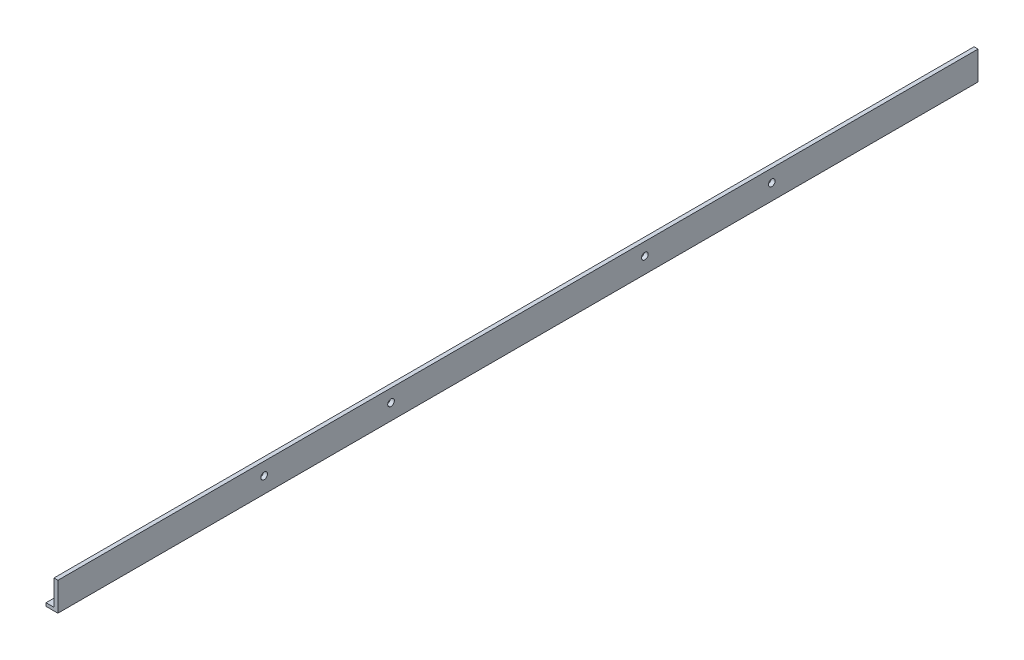
ISO-10303-21;
HEADER;
FILE_DESCRIPTION(('STEP AP214'),'2;1');
FILE_NAME('part.step','',(''),(''),'','','');
FILE_SCHEMA(('AUTOMOTIVE_DESIGN { 1 0 10303 214 1 1 1 1 }'));
ENDSEC;
DATA;
#1=APPLICATION_CONTEXT('core data for automotive mechanical design processes');
#2=APPLICATION_PROTOCOL_DEFINITION('international standard','automotive_design',2000,#1);
#3=PRODUCT_CONTEXT('',#1,'mechanical');
#4=PRODUCT('Part','Part','',(#3));
#5=PRODUCT_RELATED_PRODUCT_CATEGORY('part','',(#4));
#6=PRODUCT_DEFINITION_FORMATION('','',#4);
#7=PRODUCT_DEFINITION_CONTEXT('part definition',#1,'design');
#8=PRODUCT_DEFINITION('design','',#6,#7);
#9=PRODUCT_DEFINITION_SHAPE('','',#8);
#10=(LENGTH_UNIT() NAMED_UNIT(*) SI_UNIT(.MILLI.,.METRE.));
#11=(NAMED_UNIT(*) PLANE_ANGLE_UNIT() SI_UNIT($,.RADIAN.));
#12=(NAMED_UNIT(*) SI_UNIT($,.STERADIAN.) SOLID_ANGLE_UNIT());
#13=UNCERTAINTY_MEASURE_WITH_UNIT(LENGTH_MEASURE(1.E-05),#10,'distance_accuracy_value','');
#14=(GEOMETRIC_REPRESENTATION_CONTEXT(3) GLOBAL_UNCERTAINTY_ASSIGNED_CONTEXT((#13)) GLOBAL_UNIT_ASSIGNED_CONTEXT((#10,
#11,#12)) REPRESENTATION_CONTEXT('',''));
#15=CARTESIAN_POINT('',(0.,0.,0.));
#16=DIRECTION('',(0.,0.,1.));
#17=DIRECTION('',(1.,0.,0.));
#18=AXIS2_PLACEMENT_3D('',#15,#16,#17);
#19=CARTESIAN_POINT('',(-7.5,0.,580.));
#20=DIRECTION('',(0.,1.,0.));
#21=DIRECTION('',(0.,0.,1.));
#22=AXIS2_PLACEMENT_3D('',#19,#20,#21);
#23=PLANE('',#22);
#24=DIRECTION('',(1.,0.,0.));
#25=VECTOR('',#24,1.);
#26=CARTESIAN_POINT('',(-7.5,0.,0.));
#27=LINE('',#26,#25);
#28=CARTESIAN_POINT('',(-7.5,0.,0.));
#29=VERTEX_POINT('',#28);
#30=CARTESIAN_POINT('',(0.,0.,0.));
#31=VERTEX_POINT('',#30);
#32=EDGE_CURVE('E125',#29,#31,#27,.T.);
#33=ORIENTED_EDGE('',*,*,#32,.T.);
#34=DIRECTION('',(0.,0.,-1.));
#35=VECTOR('',#34,1.);
#36=CARTESIAN_POINT('',(0.,0.,580.));
#37=LINE('',#36,#35);
#38=CARTESIAN_POINT('',(0.,0.,580.));
#39=VERTEX_POINT('',#38);
#40=EDGE_CURVE('E11',#39,#31,#37,.T.);
#41=ORIENTED_EDGE('',*,*,#40,.F.);
#42=DIRECTION('',(1.,0.,0.));
#43=VECTOR('',#42,1.);
#44=CARTESIAN_POINT('',(-7.5,0.,580.));
#45=LINE('',#44,#43);
#46=CARTESIAN_POINT('',(-7.5,0.,580.));
#47=VERTEX_POINT('',#46);
#48=EDGE_CURVE('E136',#47,#39,#45,.T.);
#49=ORIENTED_EDGE('',*,*,#48,.F.);
#50=DIRECTION('',(0.,0.,-1.));
#51=VECTOR('',#50,1.);
#52=CARTESIAN_POINT('',(-7.5,0.,580.));
#53=LINE('',#52,#51);
#54=EDGE_CURVE('E121',#47,#29,#53,.T.);
#55=ORIENTED_EDGE('',*,*,#54,.T.);
#56=EDGE_LOOP('',(#33,#41,#49,#55));
#57=FACE_BOUND('',#56,.T.);
#58=ADVANCED_FACE('F41',(#57),#23,.F.);
#59=CARTESIAN_POINT('',(0.,0.,580.));
#60=DIRECTION('',(-1.,0.,0.));
#61=DIRECTION('',(0.,0.,1.));
#62=AXIS2_PLACEMENT_3D('',#59,#60,#61);
#63=PLANE('',#62);
#64=CARTESIAN_POINT('',(0.,10.,130.));
#65=DIRECTION('',(-1.,0.,0.));
#66=DIRECTION('',(0.,0.,1.));
#67=AXIS2_PLACEMENT_3D('',#64,#65,#66);
#68=CIRCLE('',#67,2.1);
#69=CARTESIAN_POINT('',(0.,10.,132.1));
#70=VERTEX_POINT('',#69);
#71=EDGE_CURVE('E206',#70,#70,#68,.T.);
#72=ORIENTED_EDGE('',*,*,#71,.T.);
#73=EDGE_LOOP('',(#72));
#74=FACE_BOUND('',#73,.T.);
#75=CARTESIAN_POINT('',(0.,10.,210.));
#76=DIRECTION('',(-1.,0.,0.));
#77=DIRECTION('',(0.,0.,1.));
#78=AXIS2_PLACEMENT_3D('',#75,#76,#77);
#79=CIRCLE('',#78,2.1);
#80=CARTESIAN_POINT('',(0.,10.,212.1));
#81=VERTEX_POINT('',#80);
#82=EDGE_CURVE('E202',#81,#81,#79,.T.);
#83=ORIENTED_EDGE('',*,*,#82,.T.);
#84=EDGE_LOOP('',(#83));
#85=FACE_BOUND('',#84,.T.);
#86=CARTESIAN_POINT('',(0.,10.,370.));
#87=DIRECTION('',(-1.,0.,0.));
#88=DIRECTION('',(0.,0.,1.));
#89=AXIS2_PLACEMENT_3D('',#86,#87,#88);
#90=CIRCLE('',#89,2.1);
#91=CARTESIAN_POINT('',(0.,10.,372.1));
#92=VERTEX_POINT('',#91);
#93=EDGE_CURVE('E192',#92,#92,#90,.T.);
#94=ORIENTED_EDGE('',*,*,#93,.T.);
#95=EDGE_LOOP('',(#94));
#96=FACE_BOUND('',#95,.T.);
#97=CARTESIAN_POINT('',(0.,10.,450.));
#98=DIRECTION('',(-1.,0.,0.));
#99=DIRECTION('',(0.,0.,1.));
#100=AXIS2_PLACEMENT_3D('',#97,#98,#99);
#101=CIRCLE('',#100,2.1);
#102=CARTESIAN_POINT('',(0.,10.,452.1));
#103=VERTEX_POINT('',#102);
#104=EDGE_CURVE('E129',#103,#103,#101,.T.);
#105=ORIENTED_EDGE('',*,*,#104,.T.);
#106=EDGE_LOOP('',(#105));
#107=FACE_BOUND('',#106,.T.);
#108=DIRECTION('',(0.,1.,0.));
#109=VECTOR('',#108,1.);
#110=CARTESIAN_POINT('',(0.,0.,0.));
#111=LINE('',#110,#109);
#112=CARTESIAN_POINT('',(0.,18.,0.));
#113=VERTEX_POINT('',#112);
#114=EDGE_CURVE('E128',#31,#113,#111,.T.);
#115=ORIENTED_EDGE('',*,*,#114,.T.);
#116=DIRECTION('',(0.,0.,-1.));
#117=VECTOR('',#116,1.);
#118=CARTESIAN_POINT('',(0.,18.,580.));
#119=LINE('',#118,#117);
#120=CARTESIAN_POINT('',(0.,18.,580.));
#121=VERTEX_POINT('',#120);
#122=EDGE_CURVE('E49',#121,#113,#119,.T.);
#123=ORIENTED_EDGE('',*,*,#122,.F.);
#124=DIRECTION('',(0.,1.,0.));
#125=VECTOR('',#124,1.);
#126=CARTESIAN_POINT('',(0.,0.,580.));
#127=LINE('',#126,#125);
#128=EDGE_CURVE('E94',#39,#121,#127,.T.);
#129=ORIENTED_EDGE('',*,*,#128,.F.);
#130=ORIENTED_EDGE('',*,*,#40,.T.);
#131=EDGE_LOOP('',(#115,#123,#129,#130));
#132=FACE_BOUND('',#131,.T.);
#133=ADVANCED_FACE('F160',(#74,#85,#96,#107,#132),#63,.F.);
#134=CARTESIAN_POINT('',(0.,18.,580.));
#135=DIRECTION('',(0.,-1.,0.));
#136=DIRECTION('',(0.,0.,-1.));
#137=AXIS2_PLACEMENT_3D('',#134,#135,#136);
#138=PLANE('',#137);
#139=DIRECTION('',(-1.,0.,0.));
#140=VECTOR('',#139,1.);
#141=CARTESIAN_POINT('',(0.,18.,0.));
#142=LINE('',#141,#140);
#143=CARTESIAN_POINT('',(-2.5,18.,0.));
#144=VERTEX_POINT('',#143);
#145=EDGE_CURVE('E131',#113,#144,#142,.T.);
#146=ORIENTED_EDGE('',*,*,#145,.T.);
#147=DIRECTION('',(0.,0.,-1.));
#148=VECTOR('',#147,1.);
#149=CARTESIAN_POINT('',(-2.5,18.,580.));
#150=LINE('',#149,#148);
#151=CARTESIAN_POINT('',(-2.5,18.,580.));
#152=VERTEX_POINT('',#151);
#153=EDGE_CURVE('E116',#152,#144,#150,.T.);
#154=ORIENTED_EDGE('',*,*,#153,.F.);
#155=DIRECTION('',(-1.,0.,0.));
#156=VECTOR('',#155,1.);
#157=CARTESIAN_POINT('',(0.,18.,580.));
#158=LINE('',#157,#156);
#159=EDGE_CURVE('E107',#121,#152,#158,.T.);
#160=ORIENTED_EDGE('',*,*,#159,.F.);
#161=ORIENTED_EDGE('',*,*,#122,.T.);
#162=EDGE_LOOP('',(#146,#154,#160,#161));
#163=FACE_BOUND('',#162,.T.);
#164=ADVANCED_FACE('F142',(#163),#138,.F.);
#165=CARTESIAN_POINT('',(-2.5,18.,580.));
#166=DIRECTION('',(1.,0.,0.));
#167=DIRECTION('',(0.,1.,0.));
#168=AXIS2_PLACEMENT_3D('',#165,#166,#167);
#169=PLANE('',#168);
#170=CARTESIAN_POINT('',(-2.5,10.,130.));
#171=DIRECTION('',(-1.,0.,0.));
#172=DIRECTION('',(0.,0.,1.));
#173=AXIS2_PLACEMENT_3D('',#170,#171,#172);
#174=CIRCLE('',#173,2.09999999999999);
#175=CARTESIAN_POINT('',(-2.5,10.,132.1));
#176=VERTEX_POINT('',#175);
#177=EDGE_CURVE('E179',#176,#176,#174,.T.);
#178=ORIENTED_EDGE('',*,*,#177,.F.);
#179=EDGE_LOOP('',(#178));
#180=FACE_BOUND('',#179,.T.);
#181=CARTESIAN_POINT('',(-2.5,10.,210.));
#182=DIRECTION('',(-1.,0.,0.));
#183=DIRECTION('',(0.,0.,1.));
#184=AXIS2_PLACEMENT_3D('',#181,#182,#183);
#185=CIRCLE('',#184,2.09999999999999);
#186=CARTESIAN_POINT('',(-2.5,10.,212.1));
#187=VERTEX_POINT('',#186);
#188=EDGE_CURVE('E183',#187,#187,#185,.T.);
#189=ORIENTED_EDGE('',*,*,#188,.F.);
#190=EDGE_LOOP('',(#189));
#191=FACE_BOUND('',#190,.T.);
#192=CARTESIAN_POINT('',(-2.5,10.,370.));
#193=DIRECTION('',(-1.,0.,0.));
#194=DIRECTION('',(0.,0.,1.));
#195=AXIS2_PLACEMENT_3D('',#192,#193,#194);
#196=CIRCLE('',#195,2.09999999999999);
#197=CARTESIAN_POINT('',(-2.5,10.,372.1));
#198=VERTEX_POINT('',#197);
#199=EDGE_CURVE('E187',#198,#198,#196,.T.);
#200=ORIENTED_EDGE('',*,*,#199,.F.);
#201=EDGE_LOOP('',(#200));
#202=FACE_BOUND('',#201,.T.);
#203=CARTESIAN_POINT('',(-2.5,10.,450.));
#204=DIRECTION('',(-1.,0.,0.));
#205=DIRECTION('',(0.,0.,1.));
#206=AXIS2_PLACEMENT_3D('',#203,#204,#205);
#207=CIRCLE('',#206,2.09999999999999);
#208=CARTESIAN_POINT('',(-2.5,10.,452.1));
#209=VERTEX_POINT('',#208);
#210=EDGE_CURVE('E190',#209,#209,#207,.T.);
#211=ORIENTED_EDGE('',*,*,#210,.F.);
#212=EDGE_LOOP('',(#211));
#213=FACE_BOUND('',#212,.T.);
#214=DIRECTION('',(0.,-1.,0.));
#215=VECTOR('',#214,1.);
#216=CARTESIAN_POINT('',(-2.5,18.,0.));
#217=LINE('',#216,#215);
#218=CARTESIAN_POINT('',(-2.5,2.,0.));
#219=VERTEX_POINT('',#218);
#220=EDGE_CURVE('E115',#144,#219,#217,.T.);
#221=ORIENTED_EDGE('',*,*,#220,.T.);
#222=DIRECTION('',(0.,0.,-1.));
#223=VECTOR('',#222,1.);
#224=CARTESIAN_POINT('',(-2.5,2.,580.));
#225=LINE('',#224,#223);
#226=CARTESIAN_POINT('',(-2.5,2.,580.));
#227=VERTEX_POINT('',#226);
#228=EDGE_CURVE('E112',#227,#219,#225,.T.);
#229=ORIENTED_EDGE('',*,*,#228,.F.);
#230=DIRECTION('',(0.,-1.,0.));
#231=VECTOR('',#230,1.);
#232=CARTESIAN_POINT('',(-2.5,18.,580.));
#233=LINE('',#232,#231);
#234=EDGE_CURVE('E101',#152,#227,#233,.T.);
#235=ORIENTED_EDGE('',*,*,#234,.F.);
#236=ORIENTED_EDGE('',*,*,#153,.T.);
#237=EDGE_LOOP('',(#221,#229,#235,#236));
#238=FACE_BOUND('',#237,.T.);
#239=ADVANCED_FACE('F113',(#180,#191,#202,#213,#238),#169,.F.);
#240=CARTESIAN_POINT('',(-2.5,2.,580.));
#241=DIRECTION('',(0.,-1.,0.));
#242=DIRECTION('',(1.,0.,0.));
#243=AXIS2_PLACEMENT_3D('',#240,#241,#242);
#244=PLANE('',#243);
#245=DIRECTION('',(-1.,0.,0.));
#246=VECTOR('',#245,1.);
#247=CARTESIAN_POINT('',(-2.5,2.,0.));
#248=LINE('',#247,#246);
#249=CARTESIAN_POINT('',(-7.5,2.,0.));
#250=VERTEX_POINT('',#249);
#251=EDGE_CURVE('E80',#219,#250,#248,.T.);
#252=ORIENTED_EDGE('',*,*,#251,.T.);
#253=DIRECTION('',(0.,0.,-1.));
#254=VECTOR('',#253,1.);
#255=CARTESIAN_POINT('',(-7.5,2.,580.));
#256=LINE('',#255,#254);
#257=CARTESIAN_POINT('',(-7.5,2.,580.));
#258=VERTEX_POINT('',#257);
#259=EDGE_CURVE('E117',#258,#250,#256,.T.);
#260=ORIENTED_EDGE('',*,*,#259,.F.);
#261=DIRECTION('',(-1.,0.,0.));
#262=VECTOR('',#261,1.);
#263=CARTESIAN_POINT('',(-2.5,2.,580.));
#264=LINE('',#263,#262);
#265=EDGE_CURVE('E105',#227,#258,#264,.T.);
#266=ORIENTED_EDGE('',*,*,#265,.F.);
#267=ORIENTED_EDGE('',*,*,#228,.T.);
#268=EDGE_LOOP('',(#252,#260,#266,#267));
#269=FACE_BOUND('',#268,.T.);
#270=ADVANCED_FACE('F119',(#269),#244,.F.);
#271=CARTESIAN_POINT('',(-7.5,2.,580.));
#272=DIRECTION('',(1.,0.,0.));
#273=DIRECTION('',(0.,0.,-1.));
#274=AXIS2_PLACEMENT_3D('',#271,#272,#273);
#275=PLANE('',#274);
#276=DIRECTION('',(0.,-1.,0.));
#277=VECTOR('',#276,1.);
#278=CARTESIAN_POINT('',(-7.5,2.,0.));
#279=LINE('',#278,#277);
#280=EDGE_CURVE('E86',#250,#29,#279,.T.);
#281=ORIENTED_EDGE('',*,*,#280,.T.);
#282=ORIENTED_EDGE('',*,*,#54,.F.);
#283=DIRECTION('',(0.,-1.,0.));
#284=VECTOR('',#283,1.);
#285=CARTESIAN_POINT('',(-7.5,2.,580.));
#286=LINE('',#285,#284);
#287=EDGE_CURVE('E57',#258,#47,#286,.T.);
#288=ORIENTED_EDGE('',*,*,#287,.F.);
#289=ORIENTED_EDGE('',*,*,#259,.T.);
#290=EDGE_LOOP('',(#281,#282,#288,#289));
#291=FACE_BOUND('',#290,.T.);
#292=ADVANCED_FACE('F149',(#291),#275,.F.);
#293=CARTESIAN_POINT('',(0.,0.,580.));
#294=DIRECTION('',(0.,0.,1.));
#295=DIRECTION('',(1.,0.,0.));
#296=AXIS2_PLACEMENT_3D('',#293,#294,#295);
#297=PLANE('',#296);
#298=ORIENTED_EDGE('',*,*,#48,.T.);
#299=ORIENTED_EDGE('',*,*,#128,.T.);
#300=ORIENTED_EDGE('',*,*,#159,.T.);
#301=ORIENTED_EDGE('',*,*,#234,.T.);
#302=ORIENTED_EDGE('',*,*,#265,.T.);
#303=ORIENTED_EDGE('',*,*,#287,.T.);
#304=EDGE_LOOP('',(#298,#299,#300,#301,#302,#303));
#305=FACE_BOUND('',#304,.T.);
#306=ADVANCED_FACE('F103',(#305),#297,.T.);
#307=CARTESIAN_POINT('',(0.,0.,0.));
#308=DIRECTION('',(0.,0.,1.));
#309=DIRECTION('',(1.,0.,0.));
#310=AXIS2_PLACEMENT_3D('',#307,#308,#309);
#311=PLANE('',#310);
#312=ORIENTED_EDGE('',*,*,#32,.F.);
#313=ORIENTED_EDGE('',*,*,#280,.F.);
#314=ORIENTED_EDGE('',*,*,#251,.F.);
#315=ORIENTED_EDGE('',*,*,#220,.F.);
#316=ORIENTED_EDGE('',*,*,#145,.F.);
#317=ORIENTED_EDGE('',*,*,#114,.F.);
#318=EDGE_LOOP('',(#312,#313,#314,#315,#316,#317));
#319=FACE_BOUND('',#318,.T.);
#320=ADVANCED_FACE('F145',(#319),#311,.F.);
#321=CARTESIAN_POINT('',(-2.5,10.,450.));
#322=DIRECTION('',(-1.,0.,0.));
#323=DIRECTION('',(0.,0.,1.));
#324=AXIS2_PLACEMENT_3D('',#321,#322,#323);
#325=CYLINDRICAL_SURFACE('',#324,2.09999999999999);
#326=ORIENTED_EDGE('',*,*,#104,.F.);
#327=EDGE_LOOP('',(#326));
#328=FACE_BOUND('',#327,.T.);
#329=ORIENTED_EDGE('',*,*,#210,.T.);
#330=EDGE_LOOP('',(#329));
#331=FACE_BOUND('',#330,.T.);
#332=ADVANCED_FACE('F224',(#328,#331),#325,.F.);
#333=CARTESIAN_POINT('',(-2.5,10.,370.));
#334=DIRECTION('',(-1.,0.,0.));
#335=DIRECTION('',(0.,0.,1.));
#336=AXIS2_PLACEMENT_3D('',#333,#334,#335);
#337=CYLINDRICAL_SURFACE('',#336,2.09999999999999);
#338=ORIENTED_EDGE('',*,*,#93,.F.);
#339=EDGE_LOOP('',(#338));
#340=FACE_BOUND('',#339,.T.);
#341=ORIENTED_EDGE('',*,*,#199,.T.);
#342=EDGE_LOOP('',(#341));
#343=FACE_BOUND('',#342,.T.);
#344=ADVANCED_FACE('F217',(#340,#343),#337,.F.);
#345=CARTESIAN_POINT('',(-2.5,10.,210.));
#346=DIRECTION('',(-1.,0.,0.));
#347=DIRECTION('',(0.,0.,1.));
#348=AXIS2_PLACEMENT_3D('',#345,#346,#347);
#349=CYLINDRICAL_SURFACE('',#348,2.09999999999999);
#350=ORIENTED_EDGE('',*,*,#82,.F.);
#351=EDGE_LOOP('',(#350));
#352=FACE_BOUND('',#351,.T.);
#353=ORIENTED_EDGE('',*,*,#188,.T.);
#354=EDGE_LOOP('',(#353));
#355=FACE_BOUND('',#354,.T.);
#356=ADVANCED_FACE('F211',(#352,#355),#349,.F.);
#357=CARTESIAN_POINT('',(-2.5,10.,130.));
#358=DIRECTION('',(-1.,0.,0.));
#359=DIRECTION('',(0.,0.,1.));
#360=AXIS2_PLACEMENT_3D('',#357,#358,#359);
#361=CYLINDRICAL_SURFACE('',#360,2.09999999999999);
#362=ORIENTED_EDGE('',*,*,#71,.F.);
#363=EDGE_LOOP('',(#362));
#364=FACE_BOUND('',#363,.T.);
#365=ORIENTED_EDGE('',*,*,#177,.T.);
#366=EDGE_LOOP('',(#365));
#367=FACE_BOUND('',#366,.T.);
#368=ADVANCED_FACE('F209',(#364,#367),#361,.F.);
#369=CLOSED_SHELL('',(#58,#133,#164,#239,#270,#292,#306,#320,#332,#344,#356,#368));
#370=MANIFOLD_SOLID_BREP('B2',#369);
#371=ADVANCED_BREP_SHAPE_REPRESENTATION('',(#18,#370),#14);
#372=SHAPE_DEFINITION_REPRESENTATION(#9,#371);
ENDSEC;
END-ISO-10303-21;
